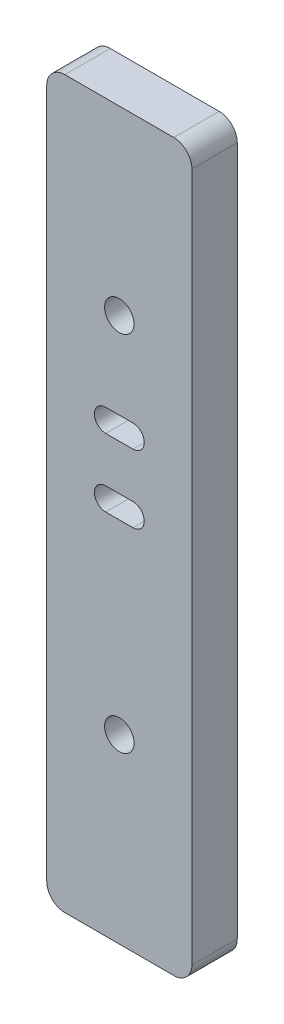
ISO-10303-21;
HEADER;
FILE_DESCRIPTION(('STEP AP214'),'2;1');
FILE_NAME('part.step','',(''),(''),'','','');
FILE_SCHEMA(('AUTOMOTIVE_DESIGN { 1 0 10303 214 1 1 1 1 }'));
ENDSEC;
DATA;
#1=APPLICATION_CONTEXT('core data for automotive mechanical design processes');
#2=APPLICATION_PROTOCOL_DEFINITION('international standard','automotive_design',2000,#1);
#3=PRODUCT_CONTEXT('',#1,'mechanical');
#4=PRODUCT('Part','Part','',(#3));
#5=PRODUCT_RELATED_PRODUCT_CATEGORY('part','',(#4));
#6=PRODUCT_DEFINITION_FORMATION('','',#4);
#7=PRODUCT_DEFINITION_CONTEXT('part definition',#1,'design');
#8=PRODUCT_DEFINITION('design','',#6,#7);
#9=PRODUCT_DEFINITION_SHAPE('','',#8);
#10=(LENGTH_UNIT() NAMED_UNIT(*) SI_UNIT(.MILLI.,.METRE.));
#11=(NAMED_UNIT(*) PLANE_ANGLE_UNIT() SI_UNIT($,.RADIAN.));
#12=(NAMED_UNIT(*) SI_UNIT($,.STERADIAN.) SOLID_ANGLE_UNIT());
#13=UNCERTAINTY_MEASURE_WITH_UNIT(LENGTH_MEASURE(1.E-05),#10,'distance_accuracy_value','');
#14=(GEOMETRIC_REPRESENTATION_CONTEXT(3) GLOBAL_UNCERTAINTY_ASSIGNED_CONTEXT((#13)) GLOBAL_UNIT_ASSIGNED_CONTEXT((#10,
#11,#12)) REPRESENTATION_CONTEXT('',''));
#15=CARTESIAN_POINT('',(0.,0.,0.));
#16=DIRECTION('',(0.,0.,1.));
#17=DIRECTION('',(1.,0.,0.));
#18=AXIS2_PLACEMENT_3D('',#15,#16,#17);
#19=CARTESIAN_POINT('',(0.,0.,5.));
#20=DIRECTION('',(0.,0.,-1.));
#21=DIRECTION('',(-1.,0.,0.));
#22=AXIS2_PLACEMENT_3D('',#19,#20,#21);
#23=PLANE('',#22);
#24=CARTESIAN_POINT('',(6.5,49.25,5.));
#25=DIRECTION('',(0.,0.,1.));
#26=DIRECTION('',(1.,0.,0.));
#27=AXIS2_PLACEMENT_3D('',#24,#25,#26);
#28=CIRCLE('',#27,1.25);
#29=CARTESIAN_POINT('',(6.5,50.5,5.));
#30=VERTEX_POINT('',#29);
#31=CARTESIAN_POINT('',(6.5,48.,5.));
#32=VERTEX_POINT('',#31);
#33=EDGE_CURVE('E194',#30,#32,#28,.T.);
#34=ORIENTED_EDGE('',*,*,#33,.F.);
#35=DIRECTION('',(-1.,0.,0.));
#36=VECTOR('',#35,1.);
#37=CARTESIAN_POINT('',(6.5,50.5,5.));
#38=LINE('',#37,#36);
#39=CARTESIAN_POINT('',(9.5,50.5,5.));
#40=VERTEX_POINT('',#39);
#41=EDGE_CURVE('E202',#40,#30,#38,.T.);
#42=ORIENTED_EDGE('',*,*,#41,.F.);
#43=CARTESIAN_POINT('',(9.5,49.25,5.));
#44=DIRECTION('',(0.,0.,1.));
#45=DIRECTION('',(1.,0.,0.));
#46=AXIS2_PLACEMENT_3D('',#43,#44,#45);
#47=CIRCLE('',#46,1.25);
#48=CARTESIAN_POINT('',(9.50000000000001,48.,5.));
#49=VERTEX_POINT('',#48);
#50=EDGE_CURVE('E199',#49,#40,#47,.T.);
#51=ORIENTED_EDGE('',*,*,#50,.F.);
#52=DIRECTION('',(1.,0.,0.));
#53=VECTOR('',#52,1.);
#54=CARTESIAN_POINT('',(6.5,48.,5.));
#55=LINE('',#54,#53);
#56=EDGE_CURVE('E196',#32,#49,#55,.T.);
#57=ORIENTED_EDGE('',*,*,#56,.F.);
#58=EDGE_LOOP('',(#34,#42,#51,#57));
#59=FACE_BOUND('',#58,.T.);
#60=DIRECTION('',(0.,-1.,0.));
#61=VECTOR('',#60,1.);
#62=CARTESIAN_POINT('',(0.,0.,5.));
#63=LINE('',#62,#61);
#64=CARTESIAN_POINT('',(0.,78.,5.));
#65=VERTEX_POINT('',#64);
#66=CARTESIAN_POINT('',(0.,2.,5.));
#67=VERTEX_POINT('',#66);
#68=EDGE_CURVE('E225',#65,#67,#63,.T.);
#69=ORIENTED_EDGE('',*,*,#68,.T.);
#70=CARTESIAN_POINT('',(2.,2.,5.));
#71=DIRECTION('',(0.,0.,-1.));
#72=DIRECTION('',(-1.,0.,0.));
#73=AXIS2_PLACEMENT_3D('',#70,#71,#72);
#74=CIRCLE('',#73,2.);
#75=CARTESIAN_POINT('',(2.,0.,5.));
#76=VERTEX_POINT('',#75);
#77=EDGE_CURVE('E268',#67,#76,#74,.F.);
#78=ORIENTED_EDGE('',*,*,#77,.T.);
#79=DIRECTION('',(1.,0.,0.));
#80=VECTOR('',#79,1.);
#81=CARTESIAN_POINT('',(0.,0.,5.));
#82=LINE('',#81,#80);
#83=CARTESIAN_POINT('',(14.,0.,5.));
#84=VERTEX_POINT('',#83);
#85=EDGE_CURVE('E228',#76,#84,#82,.T.);
#86=ORIENTED_EDGE('',*,*,#85,.T.);
#87=CARTESIAN_POINT('',(14.,2.,5.));
#88=DIRECTION('',(0.,0.,-1.));
#89=DIRECTION('',(-1.,0.,0.));
#90=AXIS2_PLACEMENT_3D('',#87,#88,#89);
#91=CIRCLE('',#90,2.);
#92=CARTESIAN_POINT('',(16.,2.,5.));
#93=VERTEX_POINT('',#92);
#94=EDGE_CURVE('E266',#84,#93,#91,.F.);
#95=ORIENTED_EDGE('',*,*,#94,.T.);
#96=DIRECTION('',(0.,1.,0.));
#97=VECTOR('',#96,1.);
#98=CARTESIAN_POINT('',(16.,0.,5.));
#99=LINE('',#98,#97);
#100=CARTESIAN_POINT('',(16.,78.,5.));
#101=VERTEX_POINT('',#100);
#102=EDGE_CURVE('E232',#93,#101,#99,.T.);
#103=ORIENTED_EDGE('',*,*,#102,.T.);
#104=CARTESIAN_POINT('',(14.,78.,5.));
#105=DIRECTION('',(0.,0.,-1.));
#106=DIRECTION('',(-1.,0.,0.));
#107=AXIS2_PLACEMENT_3D('',#104,#105,#106);
#108=CIRCLE('',#107,2.);
#109=CARTESIAN_POINT('',(14.,80.,5.));
#110=VERTEX_POINT('',#109);
#111=EDGE_CURVE('E56',#101,#110,#108,.F.);
#112=ORIENTED_EDGE('',*,*,#111,.T.);
#113=DIRECTION('',(-1.,0.,0.));
#114=VECTOR('',#113,1.);
#115=CARTESIAN_POINT('',(0.,80.,5.));
#116=LINE('',#115,#114);
#117=CARTESIAN_POINT('',(2.,80.,5.));
#118=VERTEX_POINT('',#117);
#119=EDGE_CURVE('E234',#110,#118,#116,.T.);
#120=ORIENTED_EDGE('',*,*,#119,.T.);
#121=CARTESIAN_POINT('',(2.,78.,5.));
#122=DIRECTION('',(0.,0.,-1.));
#123=DIRECTION('',(-1.,0.,0.));
#124=AXIS2_PLACEMENT_3D('',#121,#122,#123);
#125=CIRCLE('',#124,2.);
#126=EDGE_CURVE('E263',#118,#65,#125,.F.);
#127=ORIENTED_EDGE('',*,*,#126,.T.);
#128=EDGE_LOOP('',(#69,#78,#86,#95,#103,#112,#120,#127));
#129=FACE_BOUND('',#128,.T.);
#130=CARTESIAN_POINT('',(6.50000000000001,41.75,5.));
#131=DIRECTION('',(0.,0.,1.));
#132=DIRECTION('',(1.,0.,0.));
#133=AXIS2_PLACEMENT_3D('',#130,#131,#132);
#134=CIRCLE('',#133,1.25);
#135=CARTESIAN_POINT('',(6.50000000000001,43.,5.));
#136=VERTEX_POINT('',#135);
#137=CARTESIAN_POINT('',(6.50000000000001,40.5,5.));
#138=VERTEX_POINT('',#137);
#139=EDGE_CURVE('E150',#136,#138,#134,.T.);
#140=ORIENTED_EDGE('',*,*,#139,.F.);
#141=DIRECTION('',(-1.,0.,0.));
#142=VECTOR('',#141,1.);
#143=CARTESIAN_POINT('',(6.50000000000001,43.,5.));
#144=LINE('',#143,#142);
#145=CARTESIAN_POINT('',(9.5,43.,5.));
#146=VERTEX_POINT('',#145);
#147=EDGE_CURVE('E176',#146,#136,#144,.T.);
#148=ORIENTED_EDGE('',*,*,#147,.F.);
#149=CARTESIAN_POINT('',(9.50000000000001,41.75,5.));
#150=DIRECTION('',(0.,0.,1.));
#151=DIRECTION('',(1.,0.,0.));
#152=AXIS2_PLACEMENT_3D('',#149,#150,#151);
#153=CIRCLE('',#152,1.25);
#154=CARTESIAN_POINT('',(9.5,40.5,5.));
#155=VERTEX_POINT('',#154);
#156=EDGE_CURVE('E174',#155,#146,#153,.T.);
#157=ORIENTED_EDGE('',*,*,#156,.F.);
#158=DIRECTION('',(1.,0.,0.));
#159=VECTOR('',#158,1.);
#160=CARTESIAN_POINT('',(6.50000000000001,40.5,5.));
#161=LINE('',#160,#159);
#162=EDGE_CURVE('E160',#138,#155,#161,.T.);
#163=ORIENTED_EDGE('',*,*,#162,.F.);
#164=EDGE_LOOP('',(#140,#148,#157,#163));
#165=FACE_BOUND('',#164,.T.);
#166=CARTESIAN_POINT('',(8.00000000000001,20.,5.));
#167=DIRECTION('',(0.,0.,1.));
#168=DIRECTION('',(1.,0.,0.));
#169=AXIS2_PLACEMENT_3D('',#166,#167,#168);
#170=CIRCLE('',#169,1.625);
#171=CARTESIAN_POINT('',(9.62500000000001,20.,5.));
#172=VERTEX_POINT('',#171);
#173=EDGE_CURVE('E183',#172,#172,#170,.T.);
#174=ORIENTED_EDGE('',*,*,#173,.F.);
#175=EDGE_LOOP('',(#174));
#176=FACE_BOUND('',#175,.T.);
#177=CARTESIAN_POINT('',(8.,60.,5.));
#178=DIRECTION('',(0.,0.,1.));
#179=DIRECTION('',(1.,0.,0.));
#180=AXIS2_PLACEMENT_3D('',#177,#178,#179);
#181=CIRCLE('',#180,1.625);
#182=CARTESIAN_POINT('',(9.62500000000001,60.,5.));
#183=VERTEX_POINT('',#182);
#184=EDGE_CURVE('E488',#183,#183,#181,.T.);
#185=ORIENTED_EDGE('',*,*,#184,.F.);
#186=EDGE_LOOP('',(#185));
#187=FACE_BOUND('',#186,.T.);
#188=ADVANCED_FACE('F35',(#59,#129,#165,#176,#187),#23,.F.);
#189=CARTESIAN_POINT('',(0.,0.,0.));
#190=DIRECTION('',(0.,0.,-1.));
#191=DIRECTION('',(-1.,0.,0.));
#192=AXIS2_PLACEMENT_3D('',#189,#190,#191);
#193=PLANE('',#192);
#194=CARTESIAN_POINT('',(8.00000000000001,20.,0.));
#195=DIRECTION('',(0.,0.,1.));
#196=DIRECTION('',(1.,0.,0.));
#197=AXIS2_PLACEMENT_3D('',#194,#195,#196);
#198=CIRCLE('',#197,1.625);
#199=CARTESIAN_POINT('',(9.62500000000001,20.,0.));
#200=VERTEX_POINT('',#199);
#201=EDGE_CURVE('E494',#200,#200,#198,.T.);
#202=ORIENTED_EDGE('',*,*,#201,.T.);
#203=EDGE_LOOP('',(#202));
#204=FACE_BOUND('',#203,.T.);
#205=DIRECTION('',(1.,0.,0.));
#206=VECTOR('',#205,1.);
#207=CARTESIAN_POINT('',(0.,0.,0.));
#208=LINE('',#207,#206);
#209=CARTESIAN_POINT('',(2.,0.,0.));
#210=VERTEX_POINT('',#209);
#211=CARTESIAN_POINT('',(14.,0.,0.));
#212=VERTEX_POINT('',#211);
#213=EDGE_CURVE('E239',#210,#212,#208,.T.);
#214=ORIENTED_EDGE('',*,*,#213,.F.);
#215=CARTESIAN_POINT('',(2.,2.,0.));
#216=DIRECTION('',(0.,0.,-1.));
#217=DIRECTION('',(-1.,0.,0.));
#218=AXIS2_PLACEMENT_3D('',#215,#216,#217);
#219=CIRCLE('',#218,2.);
#220=CARTESIAN_POINT('',(0.,2.,0.));
#221=VERTEX_POINT('',#220);
#222=EDGE_CURVE('E256',#210,#221,#219,.T.);
#223=ORIENTED_EDGE('',*,*,#222,.T.);
#224=DIRECTION('',(0.,-1.,0.));
#225=VECTOR('',#224,1.);
#226=CARTESIAN_POINT('',(0.,0.,0.));
#227=LINE('',#226,#225);
#228=CARTESIAN_POINT('',(0.,78.,0.));
#229=VERTEX_POINT('',#228);
#230=EDGE_CURVE('E224',#229,#221,#227,.T.);
#231=ORIENTED_EDGE('',*,*,#230,.F.);
#232=CARTESIAN_POINT('',(2.,78.,0.));
#233=DIRECTION('',(0.,0.,-1.));
#234=DIRECTION('',(-1.,0.,0.));
#235=AXIS2_PLACEMENT_3D('',#232,#233,#234);
#236=CIRCLE('',#235,2.);
#237=CARTESIAN_POINT('',(2.,80.,0.));
#238=VERTEX_POINT('',#237);
#239=EDGE_CURVE('E250',#229,#238,#236,.T.);
#240=ORIENTED_EDGE('',*,*,#239,.T.);
#241=DIRECTION('',(-1.,0.,0.));
#242=VECTOR('',#241,1.);
#243=CARTESIAN_POINT('',(0.,80.,0.));
#244=LINE('',#243,#242);
#245=CARTESIAN_POINT('',(14.,80.,0.));
#246=VERTEX_POINT('',#245);
#247=EDGE_CURVE('E229',#246,#238,#244,.T.);
#248=ORIENTED_EDGE('',*,*,#247,.F.);
#249=CARTESIAN_POINT('',(14.,78.,0.));
#250=DIRECTION('',(0.,0.,-1.));
#251=DIRECTION('',(-1.,0.,0.));
#252=AXIS2_PLACEMENT_3D('',#249,#250,#251);
#253=CIRCLE('',#252,2.);
#254=CARTESIAN_POINT('',(16.,78.,0.));
#255=VERTEX_POINT('',#254);
#256=EDGE_CURVE('E252',#246,#255,#253,.T.);
#257=ORIENTED_EDGE('',*,*,#256,.T.);
#258=DIRECTION('',(0.,1.,0.));
#259=VECTOR('',#258,1.);
#260=CARTESIAN_POINT('',(16.,0.,0.));
#261=LINE('',#260,#259);
#262=CARTESIAN_POINT('',(16.,2.,0.));
#263=VERTEX_POINT('',#262);
#264=EDGE_CURVE('E242',#263,#255,#261,.T.);
#265=ORIENTED_EDGE('',*,*,#264,.F.);
#266=CARTESIAN_POINT('',(14.,2.,0.));
#267=DIRECTION('',(0.,0.,-1.));
#268=DIRECTION('',(-1.,0.,0.));
#269=AXIS2_PLACEMENT_3D('',#266,#267,#268);
#270=CIRCLE('',#269,2.);
#271=EDGE_CURVE('E254',#263,#212,#270,.T.);
#272=ORIENTED_EDGE('',*,*,#271,.T.);
#273=EDGE_LOOP('',(#214,#223,#231,#240,#248,#257,#265,#272));
#274=FACE_BOUND('',#273,.T.);
#275=DIRECTION('',(-1.,0.,0.));
#276=VECTOR('',#275,1.);
#277=CARTESIAN_POINT('',(6.5,50.5,0.));
#278=LINE('',#277,#276);
#279=CARTESIAN_POINT('',(9.5,50.5,0.));
#280=VERTEX_POINT('',#279);
#281=CARTESIAN_POINT('',(6.5,50.5,0.));
#282=VERTEX_POINT('',#281);
#283=EDGE_CURVE('E197',#280,#282,#278,.T.);
#284=ORIENTED_EDGE('',*,*,#283,.T.);
#285=CARTESIAN_POINT('',(6.5,49.25,0.));
#286=DIRECTION('',(0.,0.,1.));
#287=DIRECTION('',(1.,0.,0.));
#288=AXIS2_PLACEMENT_3D('',#285,#286,#287);
#289=CIRCLE('',#288,1.25);
#290=CARTESIAN_POINT('',(6.5,48.,0.));
#291=VERTEX_POINT('',#290);
#292=EDGE_CURVE('E168',#282,#291,#289,.T.);
#293=ORIENTED_EDGE('',*,*,#292,.T.);
#294=DIRECTION('',(1.,0.,0.));
#295=VECTOR('',#294,1.);
#296=CARTESIAN_POINT('',(6.5,48.,0.));
#297=LINE('',#296,#295);
#298=CARTESIAN_POINT('',(9.50000000000001,48.,0.));
#299=VERTEX_POINT('',#298);
#300=EDGE_CURVE('E207',#291,#299,#297,.T.);
#301=ORIENTED_EDGE('',*,*,#300,.T.);
#302=CARTESIAN_POINT('',(9.5,49.25,0.));
#303=DIRECTION('',(0.,0.,1.));
#304=DIRECTION('',(1.,0.,0.));
#305=AXIS2_PLACEMENT_3D('',#302,#303,#304);
#306=CIRCLE('',#305,1.25);
#307=EDGE_CURVE('E210',#299,#280,#306,.T.);
#308=ORIENTED_EDGE('',*,*,#307,.T.);
#309=EDGE_LOOP('',(#284,#293,#301,#308));
#310=FACE_BOUND('',#309,.T.);
#311=DIRECTION('',(-1.,0.,0.));
#312=VECTOR('',#311,1.);
#313=CARTESIAN_POINT('',(6.50000000000001,43.,0.));
#314=LINE('',#313,#312);
#315=CARTESIAN_POINT('',(9.5,43.,0.));
#316=VERTEX_POINT('',#315);
#317=CARTESIAN_POINT('',(6.50000000000001,43.,0.));
#318=VERTEX_POINT('',#317);
#319=EDGE_CURVE('E161',#316,#318,#314,.T.);
#320=ORIENTED_EDGE('',*,*,#319,.T.);
#321=CARTESIAN_POINT('',(6.50000000000001,41.75,0.));
#322=DIRECTION('',(0.,0.,1.));
#323=DIRECTION('',(1.,0.,0.));
#324=AXIS2_PLACEMENT_3D('',#321,#322,#323);
#325=CIRCLE('',#324,1.25);
#326=CARTESIAN_POINT('',(6.50000000000001,40.5,0.));
#327=VERTEX_POINT('',#326);
#328=EDGE_CURVE('E181',#318,#327,#325,.T.);
#329=ORIENTED_EDGE('',*,*,#328,.T.);
#330=DIRECTION('',(1.,0.,0.));
#331=VECTOR('',#330,1.);
#332=CARTESIAN_POINT('',(6.50000000000001,40.5,0.));
#333=LINE('',#332,#331);
#334=CARTESIAN_POINT('',(9.5,40.5,0.));
#335=VERTEX_POINT('',#334);
#336=EDGE_CURVE('E167',#327,#335,#333,.T.);
#337=ORIENTED_EDGE('',*,*,#336,.T.);
#338=CARTESIAN_POINT('',(9.50000000000001,41.75,0.));
#339=DIRECTION('',(0.,0.,1.));
#340=DIRECTION('',(1.,0.,0.));
#341=AXIS2_PLACEMENT_3D('',#338,#339,#340);
#342=CIRCLE('',#341,1.25);
#343=EDGE_CURVE('E185',#335,#316,#342,.T.);
#344=ORIENTED_EDGE('',*,*,#343,.T.);
#345=EDGE_LOOP('',(#320,#329,#337,#344));
#346=FACE_BOUND('',#345,.T.);
#347=CARTESIAN_POINT('',(8.,60.,0.));
#348=DIRECTION('',(0.,0.,1.));
#349=DIRECTION('',(1.,0.,0.));
#350=AXIS2_PLACEMENT_3D('',#347,#348,#349);
#351=CIRCLE('',#350,1.625);
#352=CARTESIAN_POINT('',(9.62500000000001,60.,0.));
#353=VERTEX_POINT('',#352);
#354=EDGE_CURVE('E491',#353,#353,#351,.T.);
#355=ORIENTED_EDGE('',*,*,#354,.T.);
#356=EDGE_LOOP('',(#355));
#357=FACE_BOUND('',#356,.T.);
#358=ADVANCED_FACE('F284',(#204,#274,#310,#346,#357),#193,.T.);
#359=CARTESIAN_POINT('',(0.,0.,5.));
#360=DIRECTION('',(1.,0.,0.));
#361=DIRECTION('',(0.,0.,-1.));
#362=AXIS2_PLACEMENT_3D('',#359,#360,#361);
#363=PLANE('',#362);
#364=ORIENTED_EDGE('',*,*,#230,.T.);
#365=DIRECTION('',(0.,0.,-1.));
#366=VECTOR('',#365,1.);
#367=CARTESIAN_POINT('',(0.,2.,5.));
#368=LINE('',#367,#366);
#369=EDGE_CURVE('E261',#221,#67,#368,.F.);
#370=ORIENTED_EDGE('',*,*,#369,.T.);
#371=ORIENTED_EDGE('',*,*,#68,.F.);
#372=DIRECTION('',(0.,0.,-1.));
#373=VECTOR('',#372,1.);
#374=CARTESIAN_POINT('',(0.,78.,5.));
#375=LINE('',#374,#373);
#376=EDGE_CURVE('E258',#65,#229,#375,.T.);
#377=ORIENTED_EDGE('',*,*,#376,.T.);
#378=EDGE_LOOP('',(#364,#370,#371,#377));
#379=FACE_BOUND('',#378,.T.);
#380=ADVANCED_FACE('F297',(#379),#363,.F.);
#381=CARTESIAN_POINT('',(0.,0.,5.));
#382=DIRECTION('',(0.,1.,0.));
#383=DIRECTION('',(-1.,0.,0.));
#384=AXIS2_PLACEMENT_3D('',#381,#382,#383);
#385=PLANE('',#384);
#386=ORIENTED_EDGE('',*,*,#85,.F.);
#387=DIRECTION('',(0.,0.,-1.));
#388=VECTOR('',#387,1.);
#389=CARTESIAN_POINT('',(2.,0.,5.));
#390=LINE('',#389,#388);
#391=EDGE_CURVE('E247',#76,#210,#390,.T.);
#392=ORIENTED_EDGE('',*,*,#391,.T.);
#393=ORIENTED_EDGE('',*,*,#213,.T.);
#394=DIRECTION('',(0.,0.,-1.));
#395=VECTOR('',#394,1.);
#396=CARTESIAN_POINT('',(14.,0.,5.));
#397=LINE('',#396,#395);
#398=EDGE_CURVE('E236',#212,#84,#397,.F.);
#399=ORIENTED_EDGE('',*,*,#398,.T.);
#400=EDGE_LOOP('',(#386,#392,#393,#399));
#401=FACE_BOUND('',#400,.T.);
#402=ADVANCED_FACE('F305',(#401),#385,.F.);
#403=CARTESIAN_POINT('',(16.,0.,5.));
#404=DIRECTION('',(-1.,0.,0.));
#405=DIRECTION('',(0.,-1.,0.));
#406=AXIS2_PLACEMENT_3D('',#403,#404,#405);
#407=PLANE('',#406);
#408=ORIENTED_EDGE('',*,*,#102,.F.);
#409=DIRECTION('',(0.,0.,-1.));
#410=VECTOR('',#409,1.);
#411=CARTESIAN_POINT('',(16.,2.,5.));
#412=LINE('',#411,#410);
#413=EDGE_CURVE('E272',#93,#263,#412,.T.);
#414=ORIENTED_EDGE('',*,*,#413,.T.);
#415=ORIENTED_EDGE('',*,*,#264,.T.);
#416=DIRECTION('',(0.,0.,-1.));
#417=VECTOR('',#416,1.);
#418=CARTESIAN_POINT('',(16.,78.,5.));
#419=LINE('',#418,#417);
#420=EDGE_CURVE('E270',#255,#101,#419,.F.);
#421=ORIENTED_EDGE('',*,*,#420,.T.);
#422=EDGE_LOOP('',(#408,#414,#415,#421));
#423=FACE_BOUND('',#422,.T.);
#424=ADVANCED_FACE('F278',(#423),#407,.F.);
#425=CARTESIAN_POINT('',(0.,80.,5.));
#426=DIRECTION('',(0.,-1.,0.));
#427=DIRECTION('',(0.,0.,-1.));
#428=AXIS2_PLACEMENT_3D('',#425,#426,#427);
#429=PLANE('',#428);
#430=ORIENTED_EDGE('',*,*,#119,.F.);
#431=DIRECTION('',(0.,0.,-1.));
#432=VECTOR('',#431,1.);
#433=CARTESIAN_POINT('',(14.,80.,5.));
#434=LINE('',#433,#432);
#435=EDGE_CURVE('E11',#110,#246,#434,.T.);
#436=ORIENTED_EDGE('',*,*,#435,.T.);
#437=ORIENTED_EDGE('',*,*,#247,.T.);
#438=DIRECTION('',(0.,0.,-1.));
#439=VECTOR('',#438,1.);
#440=CARTESIAN_POINT('',(2.,80.,5.));
#441=LINE('',#440,#439);
#442=EDGE_CURVE('E43',#238,#118,#441,.F.);
#443=ORIENTED_EDGE('',*,*,#442,.T.);
#444=EDGE_LOOP('',(#430,#436,#437,#443));
#445=FACE_BOUND('',#444,.T.);
#446=ADVANCED_FACE('F290',(#445),#429,.F.);
#447=CARTESIAN_POINT('',(6.5,49.25,5.));
#448=DIRECTION('',(0.,0.,-1.));
#449=DIRECTION('',(-1.,0.,0.));
#450=AXIS2_PLACEMENT_3D('',#447,#448,#449);
#451=CYLINDRICAL_SURFACE('',#450,1.25);
#452=ORIENTED_EDGE('',*,*,#292,.F.);
#453=DIRECTION('',(0.,0.,-1.));
#454=VECTOR('',#453,1.);
#455=CARTESIAN_POINT('',(6.5,50.5,5.));
#456=LINE('',#455,#454);
#457=EDGE_CURVE('E204',#30,#282,#456,.T.);
#458=ORIENTED_EDGE('',*,*,#457,.F.);
#459=ORIENTED_EDGE('',*,*,#33,.T.);
#460=DIRECTION('',(0.,0.,-1.));
#461=VECTOR('',#460,1.);
#462=CARTESIAN_POINT('',(6.5,48.,5.));
#463=LINE('',#462,#461);
#464=EDGE_CURVE('E221',#32,#291,#463,.T.);
#465=ORIENTED_EDGE('',*,*,#464,.T.);
#466=EDGE_LOOP('',(#452,#458,#459,#465));
#467=FACE_BOUND('',#466,.T.);
#468=ADVANCED_FACE('F326',(#467),#451,.F.);
#469=CARTESIAN_POINT('',(6.5,48.,5.));
#470=DIRECTION('',(0.,1.,0.));
#471=DIRECTION('',(0.,0.,1.));
#472=AXIS2_PLACEMENT_3D('',#469,#470,#471);
#473=PLANE('',#472);
#474=ORIENTED_EDGE('',*,*,#300,.F.);
#475=ORIENTED_EDGE('',*,*,#464,.F.);
#476=ORIENTED_EDGE('',*,*,#56,.T.);
#477=DIRECTION('',(0.,0.,-1.));
#478=VECTOR('',#477,1.);
#479=CARTESIAN_POINT('',(9.50000000000001,48.,5.));
#480=LINE('',#479,#478);
#481=EDGE_CURVE('E219',#49,#299,#480,.T.);
#482=ORIENTED_EDGE('',*,*,#481,.T.);
#483=EDGE_LOOP('',(#474,#475,#476,#482));
#484=FACE_BOUND('',#483,.T.);
#485=ADVANCED_FACE('F359',(#484),#473,.T.);
#486=CARTESIAN_POINT('',(9.5,49.25,5.));
#487=DIRECTION('',(0.,0.,-1.));
#488=DIRECTION('',(-1.,0.,0.));
#489=AXIS2_PLACEMENT_3D('',#486,#487,#488);
#490=CYLINDRICAL_SURFACE('',#489,1.25);
#491=ORIENTED_EDGE('',*,*,#307,.F.);
#492=ORIENTED_EDGE('',*,*,#481,.F.);
#493=ORIENTED_EDGE('',*,*,#50,.T.);
#494=DIRECTION('',(0.,0.,-1.));
#495=VECTOR('',#494,1.);
#496=CARTESIAN_POINT('',(9.5,50.5,5.));
#497=LINE('',#496,#495);
#498=EDGE_CURVE('E217',#40,#280,#497,.T.);
#499=ORIENTED_EDGE('',*,*,#498,.T.);
#500=EDGE_LOOP('',(#491,#492,#493,#499));
#501=FACE_BOUND('',#500,.T.);
#502=ADVANCED_FACE('F366',(#501),#490,.F.);
#503=CARTESIAN_POINT('',(6.5,50.5,5.));
#504=DIRECTION('',(0.,-1.,0.));
#505=DIRECTION('',(0.,0.,-1.));
#506=AXIS2_PLACEMENT_3D('',#503,#504,#505);
#507=PLANE('',#506);
#508=ORIENTED_EDGE('',*,*,#283,.F.);
#509=ORIENTED_EDGE('',*,*,#498,.F.);
#510=ORIENTED_EDGE('',*,*,#41,.T.);
#511=ORIENTED_EDGE('',*,*,#457,.T.);
#512=EDGE_LOOP('',(#508,#509,#510,#511));
#513=FACE_BOUND('',#512,.T.);
#514=ADVANCED_FACE('F373',(#513),#507,.T.);
#515=CARTESIAN_POINT('',(6.50000000000001,41.75,5.));
#516=DIRECTION('',(0.,0.,-1.));
#517=DIRECTION('',(-1.,0.,0.));
#518=AXIS2_PLACEMENT_3D('',#515,#516,#517);
#519=CYLINDRICAL_SURFACE('',#518,1.25);
#520=ORIENTED_EDGE('',*,*,#328,.F.);
#521=DIRECTION('',(0.,0.,-1.));
#522=VECTOR('',#521,1.);
#523=CARTESIAN_POINT('',(6.50000000000001,43.,5.));
#524=LINE('',#523,#522);
#525=EDGE_CURVE('E156',#136,#318,#524,.T.);
#526=ORIENTED_EDGE('',*,*,#525,.F.);
#527=ORIENTED_EDGE('',*,*,#139,.T.);
#528=DIRECTION('',(0.,0.,-1.));
#529=VECTOR('',#528,1.);
#530=CARTESIAN_POINT('',(6.50000000000001,40.5,5.));
#531=LINE('',#530,#529);
#532=EDGE_CURVE('E153',#138,#327,#531,.T.);
#533=ORIENTED_EDGE('',*,*,#532,.T.);
#534=EDGE_LOOP('',(#520,#526,#527,#533));
#535=FACE_BOUND('',#534,.T.);
#536=ADVANCED_FACE('F152',(#535),#519,.F.);
#537=CARTESIAN_POINT('',(6.50000000000001,40.5,5.));
#538=DIRECTION('',(0.,1.,0.));
#539=DIRECTION('',(0.,0.,1.));
#540=AXIS2_PLACEMENT_3D('',#537,#538,#539);
#541=PLANE('',#540);
#542=ORIENTED_EDGE('',*,*,#336,.F.);
#543=ORIENTED_EDGE('',*,*,#532,.F.);
#544=ORIENTED_EDGE('',*,*,#162,.T.);
#545=DIRECTION('',(0.,0.,-1.));
#546=VECTOR('',#545,1.);
#547=CARTESIAN_POINT('',(9.5,40.5,5.));
#548=LINE('',#547,#546);
#549=EDGE_CURVE('E169',#155,#335,#548,.T.);
#550=ORIENTED_EDGE('',*,*,#549,.T.);
#551=EDGE_LOOP('',(#542,#543,#544,#550));
#552=FACE_BOUND('',#551,.T.);
#553=ADVANCED_FACE('F164',(#552),#541,.T.);
#554=CARTESIAN_POINT('',(9.50000000000001,41.75,5.));
#555=DIRECTION('',(0.,0.,-1.));
#556=DIRECTION('',(-1.,0.,0.));
#557=AXIS2_PLACEMENT_3D('',#554,#555,#556);
#558=CYLINDRICAL_SURFACE('',#557,1.25);
#559=ORIENTED_EDGE('',*,*,#343,.F.);
#560=ORIENTED_EDGE('',*,*,#549,.F.);
#561=ORIENTED_EDGE('',*,*,#156,.T.);
#562=DIRECTION('',(0.,0.,-1.));
#563=VECTOR('',#562,1.);
#564=CARTESIAN_POINT('',(9.5,43.,5.));
#565=LINE('',#564,#563);
#566=EDGE_CURVE('E191',#146,#316,#565,.T.);
#567=ORIENTED_EDGE('',*,*,#566,.T.);
#568=EDGE_LOOP('',(#559,#560,#561,#567));
#569=FACE_BOUND('',#568,.T.);
#570=ADVANCED_FACE('F394',(#569),#558,.F.);
#571=CARTESIAN_POINT('',(6.50000000000001,43.,5.));
#572=DIRECTION('',(0.,-1.,0.));
#573=DIRECTION('',(0.,0.,-1.));
#574=AXIS2_PLACEMENT_3D('',#571,#572,#573);
#575=PLANE('',#574);
#576=ORIENTED_EDGE('',*,*,#319,.F.);
#577=ORIENTED_EDGE('',*,*,#566,.F.);
#578=ORIENTED_EDGE('',*,*,#147,.T.);
#579=ORIENTED_EDGE('',*,*,#525,.T.);
#580=EDGE_LOOP('',(#576,#577,#578,#579));
#581=FACE_BOUND('',#580,.T.);
#582=ADVANCED_FACE('F401',(#581),#575,.T.);
#583=CARTESIAN_POINT('',(8.00000000000001,20.,5.));
#584=DIRECTION('',(0.,0.,-1.));
#585=DIRECTION('',(-1.,0.,0.));
#586=AXIS2_PLACEMENT_3D('',#583,#584,#585);
#587=CYLINDRICAL_SURFACE('',#586,1.625);
#588=ORIENTED_EDGE('',*,*,#173,.T.);
#589=EDGE_LOOP('',(#588));
#590=FACE_BOUND('',#589,.T.);
#591=ORIENTED_EDGE('',*,*,#201,.F.);
#592=EDGE_LOOP('',(#591));
#593=FACE_BOUND('',#592,.T.);
#594=ADVANCED_FACE('F409',(#590,#593),#587,.F.);
#595=CARTESIAN_POINT('',(8.,60.,5.));
#596=DIRECTION('',(0.,0.,-1.));
#597=DIRECTION('',(-1.,0.,0.));
#598=AXIS2_PLACEMENT_3D('',#595,#596,#597);
#599=CYLINDRICAL_SURFACE('',#598,1.625);
#600=ORIENTED_EDGE('',*,*,#184,.T.);
#601=EDGE_LOOP('',(#600));
#602=FACE_BOUND('',#601,.T.);
#603=ORIENTED_EDGE('',*,*,#354,.F.);
#604=EDGE_LOOP('',(#603));
#605=FACE_BOUND('',#604,.T.);
#606=ADVANCED_FACE('F314',(#602,#605),#599,.F.);
#607=CARTESIAN_POINT('',(2.,2.,5.));
#608=DIRECTION('',(0.,0.,-1.));
#609=DIRECTION('',(-1.,0.,0.));
#610=AXIS2_PLACEMENT_3D('',#607,#608,#609);
#611=CYLINDRICAL_SURFACE('',#610,2.);
#612=ORIENTED_EDGE('',*,*,#77,.F.);
#613=ORIENTED_EDGE('',*,*,#369,.F.);
#614=ORIENTED_EDGE('',*,*,#222,.F.);
#615=ORIENTED_EDGE('',*,*,#391,.F.);
#616=EDGE_LOOP('',(#612,#613,#614,#615));
#617=FACE_BOUND('',#616,.T.);
#618=ADVANCED_FACE('F302',(#617),#611,.T.);
#619=CARTESIAN_POINT('',(14.,2.,5.));
#620=DIRECTION('',(0.,0.,-1.));
#621=DIRECTION('',(-1.,0.,0.));
#622=AXIS2_PLACEMENT_3D('',#619,#620,#621);
#623=CYLINDRICAL_SURFACE('',#622,2.);
#624=ORIENTED_EDGE('',*,*,#94,.F.);
#625=ORIENTED_EDGE('',*,*,#398,.F.);
#626=ORIENTED_EDGE('',*,*,#271,.F.);
#627=ORIENTED_EDGE('',*,*,#413,.F.);
#628=EDGE_LOOP('',(#624,#625,#626,#627));
#629=FACE_BOUND('',#628,.T.);
#630=ADVANCED_FACE('F307',(#629),#623,.T.);
#631=CARTESIAN_POINT('',(14.,78.,5.));
#632=DIRECTION('',(0.,0.,-1.));
#633=DIRECTION('',(-1.,0.,0.));
#634=AXIS2_PLACEMENT_3D('',#631,#632,#633);
#635=CYLINDRICAL_SURFACE('',#634,2.);
#636=ORIENTED_EDGE('',*,*,#111,.F.);
#637=ORIENTED_EDGE('',*,*,#420,.F.);
#638=ORIENTED_EDGE('',*,*,#256,.F.);
#639=ORIENTED_EDGE('',*,*,#435,.F.);
#640=EDGE_LOOP('',(#636,#637,#638,#639));
#641=FACE_BOUND('',#640,.T.);
#642=ADVANCED_FACE('F289',(#641),#635,.T.);
#643=CARTESIAN_POINT('',(2.,78.,5.));
#644=DIRECTION('',(0.,0.,-1.));
#645=DIRECTION('',(-1.,0.,0.));
#646=AXIS2_PLACEMENT_3D('',#643,#644,#645);
#647=CYLINDRICAL_SURFACE('',#646,2.);
#648=ORIENTED_EDGE('',*,*,#126,.F.);
#649=ORIENTED_EDGE('',*,*,#442,.F.);
#650=ORIENTED_EDGE('',*,*,#239,.F.);
#651=ORIENTED_EDGE('',*,*,#376,.F.);
#652=EDGE_LOOP('',(#648,#649,#650,#651));
#653=FACE_BOUND('',#652,.T.);
#654=ADVANCED_FACE('F37',(#653),#647,.T.);
#655=CLOSED_SHELL('',(#188,#358,#380,#402,#424,#446,#468,#485,#502,#514,#536,#553,#570,#582,
#594,#606,#618,#630,#642,#654));
#656=MANIFOLD_SOLID_BREP('B2',#655);
#657=ADVANCED_BREP_SHAPE_REPRESENTATION('',(#18,#656),#14);
#658=SHAPE_DEFINITION_REPRESENTATION(#9,#657);
ENDSEC;
END-ISO-10303-21;
